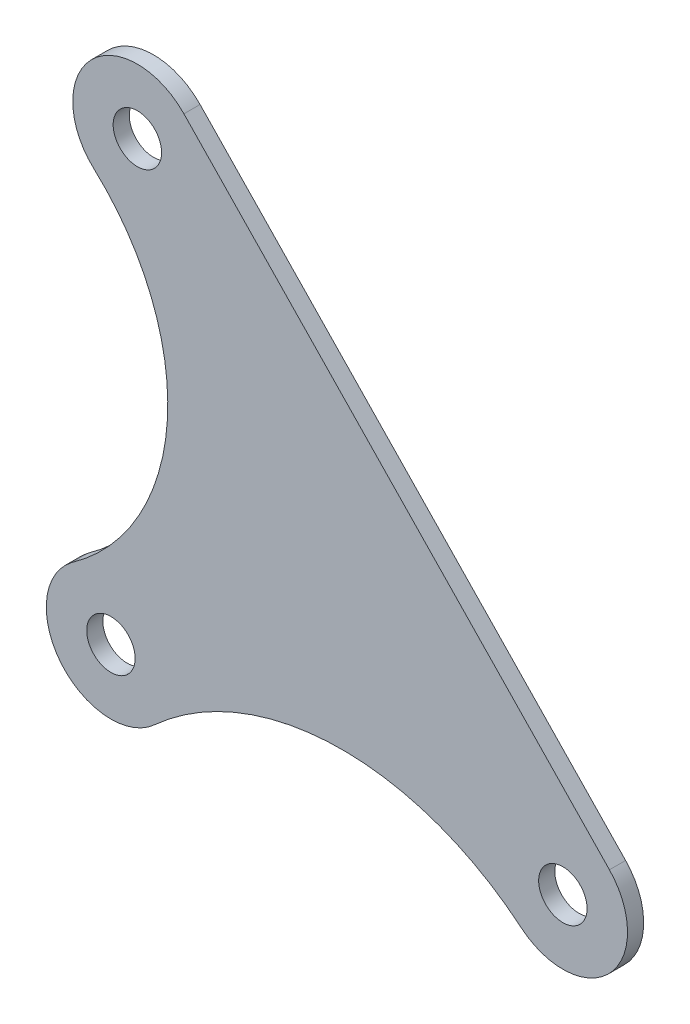
ISO-10303-21;
HEADER;
FILE_DESCRIPTION(('STEP AP214'),'2;1');
FILE_NAME('part.step','',(''),(''),'','','');
FILE_SCHEMA(('AUTOMOTIVE_DESIGN { 1 0 10303 214 1 1 1 1 }'));
ENDSEC;
DATA;
#1=APPLICATION_CONTEXT('core data for automotive mechanical design processes');
#2=APPLICATION_PROTOCOL_DEFINITION('international standard','automotive_design',2000,#1);
#3=PRODUCT_CONTEXT('',#1,'mechanical');
#4=PRODUCT('Part','Part','',(#3));
#5=PRODUCT_RELATED_PRODUCT_CATEGORY('part','',(#4));
#6=PRODUCT_DEFINITION_FORMATION('','',#4);
#7=PRODUCT_DEFINITION_CONTEXT('part definition',#1,'design');
#8=PRODUCT_DEFINITION('design','',#6,#7);
#9=PRODUCT_DEFINITION_SHAPE('','',#8);
#10=(LENGTH_UNIT() NAMED_UNIT(*) SI_UNIT(.MILLI.,.METRE.));
#11=(NAMED_UNIT(*) PLANE_ANGLE_UNIT() SI_UNIT($,.RADIAN.));
#12=(NAMED_UNIT(*) SI_UNIT($,.STERADIAN.) SOLID_ANGLE_UNIT());
#13=UNCERTAINTY_MEASURE_WITH_UNIT(LENGTH_MEASURE(1.E-05),#10,'distance_accuracy_value','');
#14=(GEOMETRIC_REPRESENTATION_CONTEXT(3) GLOBAL_UNCERTAINTY_ASSIGNED_CONTEXT((#13)) GLOBAL_UNIT_ASSIGNED_CONTEXT((#10,
#11,#12)) REPRESENTATION_CONTEXT('',''));
#15=CARTESIAN_POINT('',(0.,0.,0.));
#16=DIRECTION('',(0.,0.,1.));
#17=DIRECTION('',(1.,0.,0.));
#18=AXIS2_PLACEMENT_3D('',#15,#16,#17);
#19=CARTESIAN_POINT('',(59.759146952505,-5.29271932800727,-1.));
#20=DIRECTION('',(0.,0.,1.));
#21=DIRECTION('',(1.,0.,0.));
#22=AXIS2_PLACEMENT_3D('',#19,#20,#21);
#23=CYLINDRICAL_SURFACE('',#22,4.00396759479876);
#24=CARTESIAN_POINT('',(59.759146952505,-5.29271932800727,0.));
#25=DIRECTION('',(0.,0.,1.));
#26=DIRECTION('',(1.,0.,0.));
#27=AXIS2_PLACEMENT_3D('',#24,#25,#26);
#28=CIRCLE('',#27,4.00396759479876);
#29=CARTESIAN_POINT('',(57.1936429018531,-8.36679568787333,0.));
#30=VERTEX_POINT('',#29);
#31=CARTESIAN_POINT('',(62.6434087615039,-2.51552824395335,0.));
#32=VERTEX_POINT('',#31);
#33=EDGE_CURVE('E126',#30,#32,#28,.T.);
#34=ORIENTED_EDGE('',*,*,#33,.F.);
#35=DIRECTION('',(0.,0.,1.));
#36=VECTOR('',#35,1.);
#37=CARTESIAN_POINT('',(57.1936429018531,-8.36679568787333,-1.));
#38=LINE('',#37,#36);
#39=CARTESIAN_POINT('',(57.1936429018531,-8.36679568787333,-1.));
#40=VERTEX_POINT('',#39);
#41=EDGE_CURVE('E11',#40,#30,#38,.T.);
#42=ORIENTED_EDGE('',*,*,#41,.F.);
#43=CARTESIAN_POINT('',(59.759146952505,-5.29271932800727,-1.));
#44=DIRECTION('',(0.,0.,1.));
#45=DIRECTION('',(1.,0.,0.));
#46=AXIS2_PLACEMENT_3D('',#43,#44,#45);
#47=CIRCLE('',#46,4.00396759479876);
#48=CARTESIAN_POINT('',(62.6434087615039,-2.51552824395335,-1.));
#49=VERTEX_POINT('',#48);
#50=EDGE_CURVE('E141',#40,#49,#47,.T.);
#51=ORIENTED_EDGE('',*,*,#50,.T.);
#52=DIRECTION('',(0.,0.,1.));
#53=VECTOR('',#52,1.);
#54=CARTESIAN_POINT('',(62.6434087615039,-2.51552824395335,-1.));
#55=LINE('',#54,#53);
#56=EDGE_CURVE('E44',#49,#32,#55,.T.);
#57=ORIENTED_EDGE('',*,*,#56,.T.);
#58=EDGE_LOOP('',(#34,#42,#51,#57));
#59=FACE_BOUND('',#58,.T.);
#60=ADVANCED_FACE('F41',(#59),#23,.T.);
#61=CARTESIAN_POINT('',(46.0939331812804,-21.6668546937119,-1.));
#62=DIRECTION('',(0.,0.,1.));
#63=DIRECTION('',(1.,0.,0.));
#64=AXIS2_PLACEMENT_3D('',#61,#62,#63);
#65=CYLINDRICAL_SURFACE('',#64,17.3232538929545);
#66=CARTESIAN_POINT('',(46.0939331812804,-21.6668546937119,0.));
#67=DIRECTION('',(0.,0.,-1.));
#68=DIRECTION('',(1.,0.,0.));
#69=AXIS2_PLACEMENT_3D('',#66,#67,#68);
#70=CIRCLE('',#69,17.3232538929545);
#71=CARTESIAN_POINT('',(34.4551936009109,-8.83584279206893,0.));
#72=VERTEX_POINT('',#71);
#73=EDGE_CURVE('E139',#72,#30,#70,.T.);
#74=ORIENTED_EDGE('',*,*,#73,.F.);
#75=DIRECTION('',(0.,0.,1.));
#76=VECTOR('',#75,1.);
#77=CARTESIAN_POINT('',(34.4551936009109,-8.83584279206893,-1.));
#78=LINE('',#77,#76);
#79=CARTESIAN_POINT('',(34.4551936009109,-8.83584279206893,-1.));
#80=VERTEX_POINT('',#79);
#81=EDGE_CURVE('E50',#80,#72,#78,.T.);
#82=ORIENTED_EDGE('',*,*,#81,.F.);
#83=CARTESIAN_POINT('',(46.0939331812804,-21.6668546937119,-1.));
#84=DIRECTION('',(0.,0.,-1.));
#85=DIRECTION('',(1.,0.,0.));
#86=AXIS2_PLACEMENT_3D('',#83,#84,#85);
#87=CIRCLE('',#86,17.3232538929545);
#88=EDGE_CURVE('E116',#80,#40,#87,.T.);
#89=ORIENTED_EDGE('',*,*,#88,.T.);
#90=ORIENTED_EDGE('',*,*,#41,.T.);
#91=EDGE_LOOP('',(#74,#82,#89,#90));
#92=FACE_BOUND('',#91,.T.);
#93=ADVANCED_FACE('F149',(#92),#65,.F.);
#94=CARTESIAN_POINT('',(31.7651022120724,-5.87017847864853,-1.));
#95=DIRECTION('',(0.,0.,1.));
#96=DIRECTION('',(1.,0.,0.));
#97=AXIS2_PLACEMENT_3D('',#94,#95,#96);
#98=CYLINDRICAL_SURFACE('',#97,4.00396759479876);
#99=CARTESIAN_POINT('',(31.7651022120724,-5.87017847864853,0.));
#100=DIRECTION('',(0.,0.,1.));
#101=DIRECTION('',(1.,0.,0.));
#102=AXIS2_PLACEMENT_3D('',#99,#100,#101);
#103=CIRCLE('',#102,4.00396759479876);
#104=CARTESIAN_POINT('',(29.3493906586792,-2.67704613078051,0.));
#105=VERTEX_POINT('',#104);
#106=EDGE_CURVE('E103',#105,#72,#103,.T.);
#107=ORIENTED_EDGE('',*,*,#106,.F.);
#108=DIRECTION('',(0.,0.,1.));
#109=VECTOR('',#108,1.);
#110=CARTESIAN_POINT('',(29.3493906586792,-2.67704613078051,-1.));
#111=LINE('',#110,#109);
#112=CARTESIAN_POINT('',(29.3493906586792,-2.67704613078051,-1.));
#113=VERTEX_POINT('',#112);
#114=EDGE_CURVE('E98',#113,#105,#111,.T.);
#115=ORIENTED_EDGE('',*,*,#114,.F.);
#116=CARTESIAN_POINT('',(31.7651022120724,-5.87017847864853,-1.));
#117=DIRECTION('',(0.,0.,1.));
#118=DIRECTION('',(1.,0.,0.));
#119=AXIS2_PLACEMENT_3D('',#116,#117,#118);
#120=CIRCLE('',#119,4.00396759479876);
#121=EDGE_CURVE('E101',#113,#80,#120,.T.);
#122=ORIENTED_EDGE('',*,*,#121,.T.);
#123=ORIENTED_EDGE('',*,*,#81,.T.);
#124=EDGE_LOOP('',(#107,#115,#122,#123));
#125=FACE_BOUND('',#124,.T.);
#126=ADVANCED_FACE('F100',(#125),#98,.T.);
#127=CARTESIAN_POINT('',(21.2864006483267,8.76796116904048,-1.));
#128=DIRECTION('',(0.,0.,1.));
#129=DIRECTION('',(1.,0.,0.));
#130=AXIS2_PLACEMENT_3D('',#127,#128,#129);
#131=CYLINDRICAL_SURFACE('',#130,14.);
#132=CARTESIAN_POINT('',(21.2864006483267,8.76796116904048,0.));
#133=DIRECTION('',(0.,0.,-1.));
#134=DIRECTION('',(1.,0.,0.));
#135=AXIS2_PLACEMENT_3D('',#132,#133,#134);
#136=CIRCLE('',#135,14.);
#137=CARTESIAN_POINT('',(30.7094906941425,19.1219639693321,0.));
#138=VERTEX_POINT('',#137);
#139=EDGE_CURVE('E136',#138,#105,#136,.T.);
#140=ORIENTED_EDGE('',*,*,#139,.F.);
#141=DIRECTION('',(0.,0.,1.));
#142=VECTOR('',#141,1.);
#143=CARTESIAN_POINT('',(30.7094906941425,19.1219639693321,-1.));
#144=LINE('',#143,#142);
#145=CARTESIAN_POINT('',(30.7094906941425,19.1219639693321,-1.));
#146=VERTEX_POINT('',#145);
#147=EDGE_CURVE('E108',#146,#138,#144,.T.);
#148=ORIENTED_EDGE('',*,*,#147,.F.);
#149=CARTESIAN_POINT('',(21.2864006483267,8.76796116904048,-1.));
#150=DIRECTION('',(0.,0.,-1.));
#151=DIRECTION('',(1.,0.,0.));
#152=AXIS2_PLACEMENT_3D('',#149,#150,#151);
#153=CIRCLE('',#152,14.);
#154=EDGE_CURVE('E114',#146,#113,#153,.T.);
#155=ORIENTED_EDGE('',*,*,#154,.T.);
#156=ORIENTED_EDGE('',*,*,#114,.T.);
#157=EDGE_LOOP('',(#140,#148,#155,#156));
#158=FACE_BOUND('',#157,.T.);
#159=ADVANCED_FACE('F118',(#158),#131,.F.);
#160=CARTESIAN_POINT('',(33.4032663433047,22.0818593411446,-1.));
#161=DIRECTION('',(0.,0.,1.));
#162=DIRECTION('',(1.,0.,0.));
#163=AXIS2_PLACEMENT_3D('',#160,#161,#162);
#164=CYLINDRICAL_SURFACE('',#163,4.00217539097128);
#165=CARTESIAN_POINT('',(33.4032663433047,22.0818593411446,0.));
#166=DIRECTION('',(0.,0.,1.));
#167=DIRECTION('',(1.,0.,0.));
#168=AXIS2_PLACEMENT_3D('',#165,#166,#167);
#169=CIRCLE('',#168,4.00217539097128);
#170=CARTESIAN_POINT('',(36.2862371365971,24.8578073350953,0.));
#171=VERTEX_POINT('',#170);
#172=EDGE_CURVE('E133',#171,#138,#169,.T.);
#173=ORIENTED_EDGE('',*,*,#172,.F.);
#174=DIRECTION('',(0.,0.,1.));
#175=VECTOR('',#174,1.);
#176=CARTESIAN_POINT('',(36.2862371365971,24.8578073350953,-1.));
#177=LINE('',#176,#175);
#178=CARTESIAN_POINT('',(36.2862371365971,24.8578073350953,-1.));
#179=VERTEX_POINT('',#178);
#180=EDGE_CURVE('E144',#179,#171,#177,.T.);
#181=ORIENTED_EDGE('',*,*,#180,.F.);
#182=CARTESIAN_POINT('',(33.4032663433047,22.0818593411446,-1.));
#183=DIRECTION('',(0.,0.,1.));
#184=DIRECTION('',(1.,0.,0.));
#185=AXIS2_PLACEMENT_3D('',#182,#183,#184);
#186=CIRCLE('',#185,4.00217539097128);
#187=EDGE_CURVE('E119',#179,#146,#186,.T.);
#188=ORIENTED_EDGE('',*,*,#187,.T.);
#189=ORIENTED_EDGE('',*,*,#147,.T.);
#190=EDGE_LOOP('',(#173,#181,#188,#189));
#191=FACE_BOUND('',#190,.T.);
#192=ADVANCED_FACE('F162',(#191),#164,.T.);
#193=CARTESIAN_POINT('',(36.2862371365971,24.8578073350953,-1.));
#194=DIRECTION('',(0.720350937091919,0.693609780374235,0.));
#195=DIRECTION('',(-0.693609780374235,0.720350937091919,0.));
#196=AXIS2_PLACEMENT_3D('',#193,#194,#195);
#197=PLANE('',#196);
#198=DIRECTION('',(-0.693609780374235,0.720350937091919,0.));
#199=VECTOR('',#198,1.);
#200=CARTESIAN_POINT('',(36.2862371365971,24.8578073350953,0.));
#201=LINE('',#200,#199);
#202=EDGE_CURVE('E129',#32,#171,#201,.T.);
#203=ORIENTED_EDGE('',*,*,#202,.F.);
#204=ORIENTED_EDGE('',*,*,#56,.F.);
#205=DIRECTION('',(-0.693609780374235,0.720350937091919,0.));
#206=VECTOR('',#205,1.);
#207=CARTESIAN_POINT('',(36.2862371365971,24.8578073350953,-1.));
#208=LINE('',#207,#206);
#209=EDGE_CURVE('E121',#49,#179,#208,.T.);
#210=ORIENTED_EDGE('',*,*,#209,.T.);
#211=ORIENTED_EDGE('',*,*,#180,.T.);
#212=EDGE_LOOP('',(#203,#204,#210,#211));
#213=FACE_BOUND('',#212,.T.);
#214=ADVANCED_FACE('F146',(#213),#197,.T.);
#215=CARTESIAN_POINT('',(59.759146952505,-5.29271932800727,-1.));
#216=DIRECTION('',(0.,0.,1.));
#217=DIRECTION('',(1.,0.,0.));
#218=AXIS2_PLACEMENT_3D('',#215,#216,#217);
#219=PLANE('',#218);
#220=CARTESIAN_POINT('',(33.4032663433047,22.0818593411446,-1.));
#221=DIRECTION('',(0.,0.,1.));
#222=DIRECTION('',(1.,0.,0.));
#223=AXIS2_PLACEMENT_3D('',#220,#221,#222);
#224=CIRCLE('',#223,1.5);
#225=CARTESIAN_POINT('',(34.9032663433047,22.0818593411446,-1.));
#226=VERTEX_POINT('',#225);
#227=EDGE_CURVE('E192',#226,#226,#224,.T.);
#228=ORIENTED_EDGE('',*,*,#227,.T.);
#229=EDGE_LOOP('',(#228));
#230=FACE_BOUND('',#229,.T.);
#231=CARTESIAN_POINT('',(59.759146952505,-5.29271932800727,-1.));
#232=DIRECTION('',(0.,0.,1.));
#233=DIRECTION('',(1.,0.,0.));
#234=AXIS2_PLACEMENT_3D('',#231,#232,#233);
#235=CIRCLE('',#234,1.5);
#236=CARTESIAN_POINT('',(61.259146952505,-5.29271932800727,-1.));
#237=VERTEX_POINT('',#236);
#238=EDGE_CURVE('E200',#237,#237,#235,.T.);
#239=ORIENTED_EDGE('',*,*,#238,.T.);
#240=EDGE_LOOP('',(#239));
#241=FACE_BOUND('',#240,.T.);
#242=CARTESIAN_POINT('',(31.7651022120724,-5.87017847864853,-1.));
#243=DIRECTION('',(0.,0.,1.));
#244=DIRECTION('',(1.,0.,0.));
#245=AXIS2_PLACEMENT_3D('',#242,#243,#244);
#246=CIRCLE('',#245,1.5);
#247=CARTESIAN_POINT('',(33.2651022120724,-5.87017847864853,-1.));
#248=VERTEX_POINT('',#247);
#249=EDGE_CURVE('E130',#248,#248,#246,.T.);
#250=ORIENTED_EDGE('',*,*,#249,.T.);
#251=EDGE_LOOP('',(#250));
#252=FACE_BOUND('',#251,.T.);
#253=ORIENTED_EDGE('',*,*,#50,.F.);
#254=ORIENTED_EDGE('',*,*,#88,.F.);
#255=ORIENTED_EDGE('',*,*,#121,.F.);
#256=ORIENTED_EDGE('',*,*,#154,.F.);
#257=ORIENTED_EDGE('',*,*,#187,.F.);
#258=ORIENTED_EDGE('',*,*,#209,.F.);
#259=EDGE_LOOP('',(#253,#254,#255,#256,#257,#258));
#260=FACE_BOUND('',#259,.T.);
#261=ADVANCED_FACE('F112',(#230,#241,#252,#260),#219,.F.);
#262=CARTESIAN_POINT('',(59.759146952505,-5.29271932800727,0.));
#263=DIRECTION('',(0.,0.,1.));
#264=DIRECTION('',(1.,0.,0.));
#265=AXIS2_PLACEMENT_3D('',#262,#263,#264);
#266=PLANE('',#265);
#267=CARTESIAN_POINT('',(33.4032663433047,22.0818593411446,0.));
#268=DIRECTION('',(0.,0.,1.));
#269=DIRECTION('',(1.,0.,0.));
#270=AXIS2_PLACEMENT_3D('',#267,#268,#269);
#271=CIRCLE('',#270,1.5);
#272=CARTESIAN_POINT('',(34.9032663433047,22.0818593411446,0.));
#273=VERTEX_POINT('',#272);
#274=EDGE_CURVE('E195',#273,#273,#271,.T.);
#275=ORIENTED_EDGE('',*,*,#274,.F.);
#276=EDGE_LOOP('',(#275));
#277=FACE_BOUND('',#276,.T.);
#278=CARTESIAN_POINT('',(59.759146952505,-5.29271932800727,0.));
#279=DIRECTION('',(0.,0.,1.));
#280=DIRECTION('',(1.,0.,0.));
#281=AXIS2_PLACEMENT_3D('',#278,#279,#280);
#282=CIRCLE('',#281,1.5);
#283=CARTESIAN_POINT('',(61.259146952505,-5.29271932800727,0.));
#284=VERTEX_POINT('',#283);
#285=EDGE_CURVE('E197',#284,#284,#282,.T.);
#286=ORIENTED_EDGE('',*,*,#285,.F.);
#287=EDGE_LOOP('',(#286));
#288=FACE_BOUND('',#287,.T.);
#289=CARTESIAN_POINT('',(31.7651022120724,-5.87017847864853,0.));
#290=DIRECTION('',(0.,0.,1.));
#291=DIRECTION('',(1.,0.,0.));
#292=AXIS2_PLACEMENT_3D('',#289,#290,#291);
#293=CIRCLE('',#292,1.5);
#294=CARTESIAN_POINT('',(33.2651022120724,-5.87017847864853,0.));
#295=VERTEX_POINT('',#294);
#296=EDGE_CURVE('E203',#295,#295,#293,.T.);
#297=ORIENTED_EDGE('',*,*,#296,.F.);
#298=EDGE_LOOP('',(#297));
#299=FACE_BOUND('',#298,.T.);
#300=ORIENTED_EDGE('',*,*,#33,.T.);
#301=ORIENTED_EDGE('',*,*,#202,.T.);
#302=ORIENTED_EDGE('',*,*,#172,.T.);
#303=ORIENTED_EDGE('',*,*,#139,.T.);
#304=ORIENTED_EDGE('',*,*,#106,.T.);
#305=ORIENTED_EDGE('',*,*,#73,.T.);
#306=EDGE_LOOP('',(#300,#301,#302,#303,#304,#305));
#307=FACE_BOUND('',#306,.T.);
#308=ADVANCED_FACE('F148',(#277,#288,#299,#307),#266,.T.);
#309=CARTESIAN_POINT('',(31.7651022120724,-5.87017847864853,-1.));
#310=DIRECTION('',(0.,0.,1.));
#311=DIRECTION('',(1.,0.,0.));
#312=AXIS2_PLACEMENT_3D('',#309,#310,#311);
#313=CYLINDRICAL_SURFACE('',#312,1.5);
#314=ORIENTED_EDGE('',*,*,#249,.F.);
#315=EDGE_LOOP('',(#314));
#316=FACE_BOUND('',#315,.T.);
#317=ORIENTED_EDGE('',*,*,#296,.T.);
#318=EDGE_LOOP('',(#317));
#319=FACE_BOUND('',#318,.T.);
#320=ADVANCED_FACE('F173',(#316,#319),#313,.F.);
#321=CARTESIAN_POINT('',(59.759146952505,-5.29271932800727,-1.));
#322=DIRECTION('',(0.,0.,1.));
#323=DIRECTION('',(1.,0.,0.));
#324=AXIS2_PLACEMENT_3D('',#321,#322,#323);
#325=CYLINDRICAL_SURFACE('',#324,1.5);
#326=ORIENTED_EDGE('',*,*,#238,.F.);
#327=EDGE_LOOP('',(#326));
#328=FACE_BOUND('',#327,.T.);
#329=ORIENTED_EDGE('',*,*,#285,.T.);
#330=EDGE_LOOP('',(#329));
#331=FACE_BOUND('',#330,.T.);
#332=ADVANCED_FACE('F180',(#328,#331),#325,.F.);
#333=CARTESIAN_POINT('',(33.4032663433047,22.0818593411446,-1.));
#334=DIRECTION('',(0.,0.,1.));
#335=DIRECTION('',(1.,0.,0.));
#336=AXIS2_PLACEMENT_3D('',#333,#334,#335);
#337=CYLINDRICAL_SURFACE('',#336,1.5);
#338=ORIENTED_EDGE('',*,*,#227,.F.);
#339=EDGE_LOOP('',(#338));
#340=FACE_BOUND('',#339,.T.);
#341=ORIENTED_EDGE('',*,*,#274,.T.);
#342=EDGE_LOOP('',(#341));
#343=FACE_BOUND('',#342,.T.);
#344=ADVANCED_FACE('F184',(#340,#343),#337,.F.);
#345=CLOSED_SHELL('',(#60,#93,#126,#159,#192,#214,#261,#308,#320,#332,#344));
#346=MANIFOLD_SOLID_BREP('B2',#345);
#347=ADVANCED_BREP_SHAPE_REPRESENTATION('',(#18,#346),#14);
#348=SHAPE_DEFINITION_REPRESENTATION(#9,#347);
ENDSEC;
END-ISO-10303-21;
